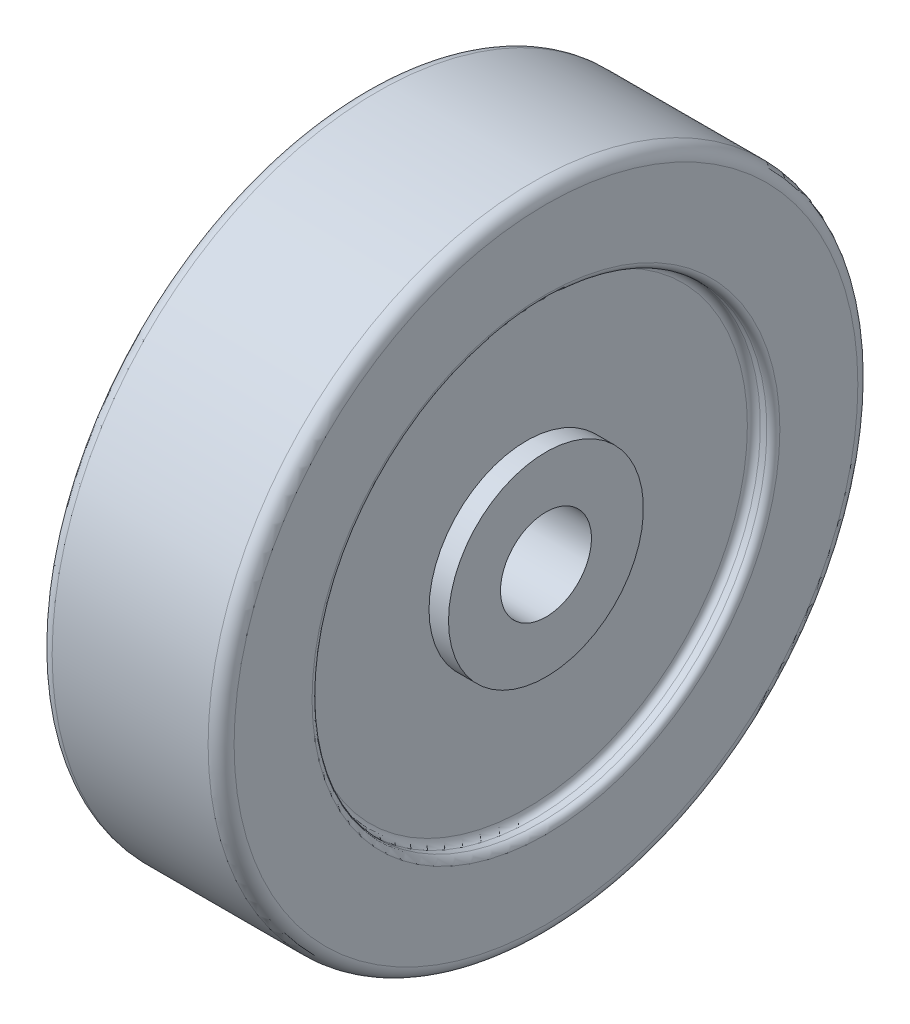
ISO-10303-21;
HEADER;
FILE_DESCRIPTION(('STEP AP214'),'2;1');
FILE_NAME('part.step','',(''),(''),'','','');
FILE_SCHEMA(('AUTOMOTIVE_DESIGN { 1 0 10303 214 1 1 1 1 }'));
ENDSEC;
DATA;
#1=APPLICATION_CONTEXT('core data for automotive mechanical design processes');
#2=APPLICATION_PROTOCOL_DEFINITION('international standard','automotive_design',2000,#1);
#3=PRODUCT_CONTEXT('',#1,'mechanical');
#4=PRODUCT('Part','Part','',(#3));
#5=PRODUCT_RELATED_PRODUCT_CATEGORY('part','',(#4));
#6=PRODUCT_DEFINITION_FORMATION('','',#4);
#7=PRODUCT_DEFINITION_CONTEXT('part definition',#1,'design');
#8=PRODUCT_DEFINITION('design','',#6,#7);
#9=PRODUCT_DEFINITION_SHAPE('','',#8);
#10=(LENGTH_UNIT() NAMED_UNIT(*) SI_UNIT(.MILLI.,.METRE.));
#11=(NAMED_UNIT(*) PLANE_ANGLE_UNIT() SI_UNIT($,.RADIAN.));
#12=(NAMED_UNIT(*) SI_UNIT($,.STERADIAN.) SOLID_ANGLE_UNIT());
#13=UNCERTAINTY_MEASURE_WITH_UNIT(LENGTH_MEASURE(1.E-05),#10,'distance_accuracy_value','');
#14=(GEOMETRIC_REPRESENTATION_CONTEXT(3) GLOBAL_UNCERTAINTY_ASSIGNED_CONTEXT((#13)) GLOBAL_UNIT_ASSIGNED_CONTEXT((#10,
#11,#12)) REPRESENTATION_CONTEXT('',''));
#15=CARTESIAN_POINT('',(0.,0.,0.));
#16=DIRECTION('',(0.,0.,1.));
#17=DIRECTION('',(1.,0.,0.));
#18=AXIS2_PLACEMENT_3D('',#15,#16,#17);
#19=CARTESIAN_POINT('',(0.,15.,0.));
#20=DIRECTION('',(1.,0.,0.));
#21=DIRECTION('',(0.,0.,-1.));
#22=AXIS2_PLACEMENT_3D('',#19,#20,#21);
#23=PLANE('',#22);
#24=CARTESIAN_POINT('',(0.,0.,0.));
#25=DIRECTION('',(-1.,0.,0.));
#26=DIRECTION('',(0.,0.,1.));
#27=AXIS2_PLACEMENT_3D('',#24,#25,#26);
#28=CIRCLE('',#27,7.);
#29=CARTESIAN_POINT('',(0.,0.,7.));
#30=VERTEX_POINT('',#29);
#31=EDGE_CURVE('E86',#30,#30,#28,.T.);
#32=ORIENTED_EDGE('',*,*,#31,.F.);
#33=EDGE_LOOP('',(#32));
#34=FACE_BOUND('',#33,.T.);
#35=CARTESIAN_POINT('',(0.,0.,0.));
#36=DIRECTION('',(-1.,0.,0.));
#37=DIRECTION('',(0.,0.,1.));
#38=AXIS2_PLACEMENT_3D('',#35,#36,#37);
#39=CIRCLE('',#38,15.);
#40=CARTESIAN_POINT('',(0.,0.,15.));
#41=VERTEX_POINT('',#40);
#42=EDGE_CURVE('E101',#41,#41,#39,.T.);
#43=ORIENTED_EDGE('',*,*,#42,.T.);
#44=EDGE_LOOP('',(#43));
#45=FACE_BOUND('',#44,.T.);
#46=ADVANCED_FACE('F42',(#34,#45),#23,.F.);
#47=CARTESIAN_POINT('',(-1.55201062501571,0.,0.));
#48=DIRECTION('',(-1.,0.,0.));
#49=DIRECTION('',(0.,0.,1.));
#50=AXIS2_PLACEMENT_3D('',#47,#48,#49);
#51=CYLINDRICAL_SURFACE('',#50,7.);
#52=CARTESIAN_POINT('',(28.,0.,0.));
#53=DIRECTION('',(-1.,0.,0.));
#54=DIRECTION('',(0.,0.,1.));
#55=AXIS2_PLACEMENT_3D('',#52,#53,#54);
#56=CIRCLE('',#55,7.);
#57=CARTESIAN_POINT('',(28.,0.,7.));
#58=VERTEX_POINT('',#57);
#59=EDGE_CURVE('E89',#58,#58,#56,.T.);
#60=ORIENTED_EDGE('',*,*,#59,.F.);
#61=EDGE_LOOP('',(#60));
#62=FACE_BOUND('',#61,.T.);
#63=ORIENTED_EDGE('',*,*,#31,.T.);
#64=EDGE_LOOP('',(#63));
#65=FACE_BOUND('',#64,.T.);
#66=ADVANCED_FACE('F125',(#62,#65),#51,.F.);
#67=CARTESIAN_POINT('',(28.,7.,0.));
#68=DIRECTION('',(-1.,0.,0.));
#69=DIRECTION('',(0.,0.,1.));
#70=AXIS2_PLACEMENT_3D('',#67,#68,#69);
#71=PLANE('',#70);
#72=CARTESIAN_POINT('',(28.,0.,0.));
#73=DIRECTION('',(-1.,0.,0.));
#74=DIRECTION('',(0.,0.,1.));
#75=AXIS2_PLACEMENT_3D('',#72,#73,#74);
#76=CIRCLE('',#75,15.);
#77=CARTESIAN_POINT('',(28.,0.,15.));
#78=VERTEX_POINT('',#77);
#79=EDGE_CURVE('E92',#78,#78,#76,.T.);
#80=ORIENTED_EDGE('',*,*,#79,.F.);
#81=EDGE_LOOP('',(#80));
#82=FACE_BOUND('',#81,.T.);
#83=ORIENTED_EDGE('',*,*,#59,.T.);
#84=EDGE_LOOP('',(#83));
#85=FACE_BOUND('',#84,.T.);
#86=ADVANCED_FACE('F131',(#82,#85),#71,.F.);
#87=CARTESIAN_POINT('',(-1.55201062501571,0.,0.));
#88=DIRECTION('',(-1.,0.,0.));
#89=DIRECTION('',(0.,0.,1.));
#90=AXIS2_PLACEMENT_3D('',#87,#88,#89);
#91=CYLINDRICAL_SURFACE('',#90,15.);
#92=CARTESIAN_POINT('',(25.,0.,0.));
#93=DIRECTION('',(-1.,0.,0.));
#94=DIRECTION('',(0.,0.,1.));
#95=AXIS2_PLACEMENT_3D('',#92,#93,#94);
#96=CIRCLE('',#95,15.);
#97=CARTESIAN_POINT('',(25.,0.,15.));
#98=VERTEX_POINT('',#97);
#99=EDGE_CURVE('E95',#98,#98,#96,.T.);
#100=ORIENTED_EDGE('',*,*,#99,.F.);
#101=EDGE_LOOP('',(#100));
#102=FACE_BOUND('',#101,.T.);
#103=ORIENTED_EDGE('',*,*,#79,.T.);
#104=EDGE_LOOP('',(#103));
#105=FACE_BOUND('',#104,.T.);
#106=ADVANCED_FACE('F185',(#102,#105),#91,.T.);
#107=CARTESIAN_POINT('',(25.,15.,0.));
#108=DIRECTION('',(-1.,0.,0.));
#109=DIRECTION('',(0.,0.,1.));
#110=AXIS2_PLACEMENT_3D('',#107,#108,#109);
#111=PLANE('',#110);
#112=CARTESIAN_POINT('',(25.,0.,0.));
#113=DIRECTION('',(-1.,0.,0.));
#114=DIRECTION('',(0.,0.,1.));
#115=AXIS2_PLACEMENT_3D('',#112,#113,#114);
#116=CIRCLE('',#115,34.);
#117=CARTESIAN_POINT('',(25.,0.,34.));
#118=VERTEX_POINT('',#117);
#119=EDGE_CURVE('E12',#118,#118,#116,.F.);
#120=ORIENTED_EDGE('',*,*,#119,.T.);
#121=EDGE_LOOP('',(#120));
#122=FACE_BOUND('',#121,.T.);
#123=ORIENTED_EDGE('',*,*,#99,.T.);
#124=EDGE_LOOP('',(#123));
#125=FACE_BOUND('',#124,.T.);
#126=ADVANCED_FACE('F182',(#122,#125),#111,.F.);
#127=CARTESIAN_POINT('',(-1.55201062501571,0.,0.));
#128=DIRECTION('',(-1.,0.,0.));
#129=DIRECTION('',(0.,0.,1.));
#130=AXIS2_PLACEMENT_3D('',#127,#128,#129);
#131=CYLINDRICAL_SURFACE('',#130,35.);
#132=CARTESIAN_POINT('',(27.,0.,0.));
#133=DIRECTION('',(-1.,0.,0.));
#134=DIRECTION('',(0.,0.,1.));
#135=AXIS2_PLACEMENT_3D('',#132,#133,#134);
#136=CIRCLE('',#135,35.);
#137=CARTESIAN_POINT('',(27.,0.,35.));
#138=VERTEX_POINT('',#137);
#139=EDGE_CURVE('E49',#138,#138,#136,.F.);
#140=ORIENTED_EDGE('',*,*,#139,.T.);
#141=EDGE_LOOP('',(#140));
#142=FACE_BOUND('',#141,.T.);
#143=CARTESIAN_POINT('',(26.,0.,0.));
#144=DIRECTION('',(-1.,0.,0.));
#145=DIRECTION('',(0.,0.,1.));
#146=AXIS2_PLACEMENT_3D('',#143,#144,#145);
#147=CIRCLE('',#146,35.);
#148=CARTESIAN_POINT('',(26.,0.,35.));
#149=VERTEX_POINT('',#148);
#150=EDGE_CURVE('E53',#149,#149,#147,.T.);
#151=ORIENTED_EDGE('',*,*,#150,.T.);
#152=EDGE_LOOP('',(#151));
#153=FACE_BOUND('',#152,.T.);
#154=ADVANCED_FACE('F165',(#142,#153),#131,.F.);
#155=CARTESIAN_POINT('',(28.,35.,0.));
#156=DIRECTION('',(-1.,0.,0.));
#157=DIRECTION('',(0.,0.,1.));
#158=AXIS2_PLACEMENT_3D('',#155,#156,#157);
#159=PLANE('',#158);
#160=CARTESIAN_POINT('',(28.,0.,0.));
#161=DIRECTION('',(-1.,0.,0.));
#162=DIRECTION('',(0.,0.,1.));
#163=AXIS2_PLACEMENT_3D('',#160,#161,#162);
#164=CIRCLE('',#163,36.);
#165=CARTESIAN_POINT('',(28.,0.,36.));
#166=VERTEX_POINT('',#165);
#167=EDGE_CURVE('E57',#166,#166,#164,.T.);
#168=ORIENTED_EDGE('',*,*,#167,.T.);
#169=EDGE_LOOP('',(#168));
#170=FACE_BOUND('',#169,.T.);
#171=CARTESIAN_POINT('',(28.,0.,0.));
#172=DIRECTION('',(-1.,0.,0.));
#173=DIRECTION('',(0.,0.,1.));
#174=AXIS2_PLACEMENT_3D('',#171,#172,#173);
#175=CIRCLE('',#174,48.);
#176=CARTESIAN_POINT('',(28.,0.,48.));
#177=VERTEX_POINT('',#176);
#178=EDGE_CURVE('E74',#177,#177,#175,.F.);
#179=ORIENTED_EDGE('',*,*,#178,.T.);
#180=EDGE_LOOP('',(#179));
#181=FACE_BOUND('',#180,.T.);
#182=ADVANCED_FACE('F161',(#170,#181),#159,.F.);
#183=CARTESIAN_POINT('',(-1.55201062501571,0.,0.));
#184=DIRECTION('',(-1.,0.,0.));
#185=DIRECTION('',(0.,0.,1.));
#186=AXIS2_PLACEMENT_3D('',#183,#184,#185);
#187=CYLINDRICAL_SURFACE('',#186,50.);
#188=CARTESIAN_POINT('',(2.,0.,0.));
#189=DIRECTION('',(1.,0.,0.));
#190=DIRECTION('',(0.,0.,-1.));
#191=AXIS2_PLACEMENT_3D('',#188,#189,#190);
#192=CIRCLE('',#191,50.);
#193=CARTESIAN_POINT('',(2.,0.,-50.));
#194=VERTEX_POINT('',#193);
#195=EDGE_CURVE('E77',#194,#194,#192,.T.);
#196=ORIENTED_EDGE('',*,*,#195,.T.);
#197=EDGE_LOOP('',(#196));
#198=FACE_BOUND('',#197,.T.);
#199=CARTESIAN_POINT('',(26.,0.,0.));
#200=DIRECTION('',(-1.,0.,0.));
#201=DIRECTION('',(0.,0.,1.));
#202=AXIS2_PLACEMENT_3D('',#199,#200,#201);
#203=CIRCLE('',#202,50.);
#204=CARTESIAN_POINT('',(26.,0.,50.));
#205=VERTEX_POINT('',#204);
#206=EDGE_CURVE('E80',#205,#205,#203,.T.);
#207=ORIENTED_EDGE('',*,*,#206,.T.);
#208=EDGE_LOOP('',(#207));
#209=FACE_BOUND('',#208,.T.);
#210=ADVANCED_FACE('F164',(#198,#209),#187,.T.);
#211=CARTESIAN_POINT('',(0.,50.,0.));
#212=DIRECTION('',(1.,0.,0.));
#213=DIRECTION('',(0.,0.,-1.));
#214=AXIS2_PLACEMENT_3D('',#211,#212,#213);
#215=PLANE('',#214);
#216=CARTESIAN_POINT('',(0.,0.,0.));
#217=DIRECTION('',(1.,0.,0.));
#218=DIRECTION('',(0.,0.,-1.));
#219=AXIS2_PLACEMENT_3D('',#216,#217,#218);
#220=CIRCLE('',#219,36.);
#221=CARTESIAN_POINT('',(0.,0.,-36.));
#222=VERTEX_POINT('',#221);
#223=EDGE_CURVE('E65',#222,#222,#220,.T.);
#224=ORIENTED_EDGE('',*,*,#223,.T.);
#225=EDGE_LOOP('',(#224));
#226=FACE_BOUND('',#225,.T.);
#227=CARTESIAN_POINT('',(0.,0.,0.));
#228=DIRECTION('',(1.,0.,0.));
#229=DIRECTION('',(0.,0.,-1.));
#230=AXIS2_PLACEMENT_3D('',#227,#228,#229);
#231=CIRCLE('',#230,48.);
#232=CARTESIAN_POINT('',(0.,0.,-48.));
#233=VERTEX_POINT('',#232);
#234=EDGE_CURVE('E83',#233,#233,#231,.F.);
#235=ORIENTED_EDGE('',*,*,#234,.T.);
#236=EDGE_LOOP('',(#235));
#237=FACE_BOUND('',#236,.T.);
#238=ADVANCED_FACE('F121',(#226,#237),#215,.F.);
#239=CARTESIAN_POINT('',(-1.55201062501571,0.,0.));
#240=DIRECTION('',(-1.,0.,0.));
#241=DIRECTION('',(0.,0.,1.));
#242=AXIS2_PLACEMENT_3D('',#239,#240,#241);
#243=CYLINDRICAL_SURFACE('',#242,35.);
#244=CARTESIAN_POINT('',(0.999999999999998,0.,0.));
#245=DIRECTION('',(1.,0.,0.));
#246=DIRECTION('',(0.,0.,-1.));
#247=AXIS2_PLACEMENT_3D('',#244,#245,#246);
#248=CIRCLE('',#247,35.);
#249=CARTESIAN_POINT('',(0.999999999999998,0.,-35.));
#250=VERTEX_POINT('',#249);
#251=EDGE_CURVE('E68',#250,#250,#248,.F.);
#252=ORIENTED_EDGE('',*,*,#251,.T.);
#253=EDGE_LOOP('',(#252));
#254=FACE_BOUND('',#253,.T.);
#255=CARTESIAN_POINT('',(2.,0.,0.));
#256=DIRECTION('',(1.,0.,0.));
#257=DIRECTION('',(0.,0.,-1.));
#258=AXIS2_PLACEMENT_3D('',#255,#256,#257);
#259=CIRCLE('',#258,35.);
#260=CARTESIAN_POINT('',(2.,0.,-35.));
#261=VERTEX_POINT('',#260);
#262=EDGE_CURVE('E71',#261,#261,#259,.T.);
#263=ORIENTED_EDGE('',*,*,#262,.T.);
#264=EDGE_LOOP('',(#263));
#265=FACE_BOUND('',#264,.T.);
#266=ADVANCED_FACE('F115',(#254,#265),#243,.F.);
#267=CARTESIAN_POINT('',(3.,35.,0.));
#268=DIRECTION('',(1.,0.,0.));
#269=DIRECTION('',(0.,0.,-1.));
#270=AXIS2_PLACEMENT_3D('',#267,#268,#269);
#271=PLANE('',#270);
#272=CARTESIAN_POINT('',(3.,0.,0.));
#273=DIRECTION('',(1.,0.,0.));
#274=DIRECTION('',(0.,0.,-1.));
#275=AXIS2_PLACEMENT_3D('',#272,#273,#274);
#276=CIRCLE('',#275,34.);
#277=CARTESIAN_POINT('',(3.,0.,-34.));
#278=VERTEX_POINT('',#277);
#279=EDGE_CURVE('E62',#278,#278,#276,.F.);
#280=ORIENTED_EDGE('',*,*,#279,.T.);
#281=EDGE_LOOP('',(#280));
#282=FACE_BOUND('',#281,.T.);
#283=CARTESIAN_POINT('',(3.,0.,0.));
#284=DIRECTION('',(-1.,0.,0.));
#285=DIRECTION('',(0.,0.,1.));
#286=AXIS2_PLACEMENT_3D('',#283,#284,#285);
#287=CIRCLE('',#286,15.);
#288=CARTESIAN_POINT('',(3.,0.,15.));
#289=VERTEX_POINT('',#288);
#290=EDGE_CURVE('E98',#289,#289,#287,.T.);
#291=ORIENTED_EDGE('',*,*,#290,.F.);
#292=EDGE_LOOP('',(#291));
#293=FACE_BOUND('',#292,.T.);
#294=ADVANCED_FACE('F110',(#282,#293),#271,.F.);
#295=CARTESIAN_POINT('',(-1.55201062501571,0.,0.));
#296=DIRECTION('',(-1.,0.,0.));
#297=DIRECTION('',(0.,0.,1.));
#298=AXIS2_PLACEMENT_3D('',#295,#296,#297);
#299=CYLINDRICAL_SURFACE('',#298,15.);
#300=ORIENTED_EDGE('',*,*,#42,.F.);
#301=EDGE_LOOP('',(#300));
#302=FACE_BOUND('',#301,.T.);
#303=ORIENTED_EDGE('',*,*,#290,.T.);
#304=EDGE_LOOP('',(#303));
#305=FACE_BOUND('',#304,.T.);
#306=ADVANCED_FACE('F106',(#302,#305),#299,.T.);
#307=CARTESIAN_POINT('',(2.,0.,0.));
#308=DIRECTION('',(1.,0.,0.));
#309=DIRECTION('',(0.,0.,-1.));
#310=AXIS2_PLACEMENT_3D('',#307,#308,#309);
#311=TOROIDAL_SURFACE('',#310,48.,2.);
#312=ORIENTED_EDGE('',*,*,#195,.F.);
#313=EDGE_LOOP('',(#312));
#314=FACE_BOUND('',#313,.T.);
#315=ORIENTED_EDGE('',*,*,#234,.F.);
#316=EDGE_LOOP('',(#315));
#317=FACE_BOUND('',#316,.T.);
#318=ADVANCED_FACE('F109',(#314,#317),#311,.T.);
#319=CARTESIAN_POINT('',(26.,0.,0.));
#320=DIRECTION('',(-1.,0.,0.));
#321=DIRECTION('',(0.,0.,1.));
#322=AXIS2_PLACEMENT_3D('',#319,#320,#321);
#323=TOROIDAL_SURFACE('',#322,48.,2.);
#324=ORIENTED_EDGE('',*,*,#178,.F.);
#325=EDGE_LOOP('',(#324));
#326=FACE_BOUND('',#325,.T.);
#327=ORIENTED_EDGE('',*,*,#206,.F.);
#328=EDGE_LOOP('',(#327));
#329=FACE_BOUND('',#328,.T.);
#330=ADVANCED_FACE('F139',(#326,#329),#323,.T.);
#331=CARTESIAN_POINT('',(0.999999999999998,0.,0.));
#332=DIRECTION('',(1.,0.,0.));
#333=DIRECTION('',(0.,0.,-1.));
#334=AXIS2_PLACEMENT_3D('',#331,#332,#333);
#335=TOROIDAL_SURFACE('',#334,36.,1.);
#336=ORIENTED_EDGE('',*,*,#223,.F.);
#337=EDGE_LOOP('',(#336));
#338=FACE_BOUND('',#337,.T.);
#339=ORIENTED_EDGE('',*,*,#251,.F.);
#340=EDGE_LOOP('',(#339));
#341=FACE_BOUND('',#340,.T.);
#342=ADVANCED_FACE('F143',(#338,#341),#335,.T.);
#343=CARTESIAN_POINT('',(2.,0.,0.));
#344=DIRECTION('',(1.,0.,0.));
#345=DIRECTION('',(0.,0.,-1.));
#346=AXIS2_PLACEMENT_3D('',#343,#344,#345);
#347=TOROIDAL_SURFACE('',#346,34.,1.);
#348=ORIENTED_EDGE('',*,*,#262,.F.);
#349=EDGE_LOOP('',(#348));
#350=FACE_BOUND('',#349,.T.);
#351=ORIENTED_EDGE('',*,*,#279,.F.);
#352=EDGE_LOOP('',(#351));
#353=FACE_BOUND('',#352,.T.);
#354=ADVANCED_FACE('F147',(#350,#353),#347,.F.);
#355=CARTESIAN_POINT('',(27.,0.,0.));
#356=DIRECTION('',(-1.,0.,0.));
#357=DIRECTION('',(0.,0.,1.));
#358=AXIS2_PLACEMENT_3D('',#355,#356,#357);
#359=TOROIDAL_SURFACE('',#358,36.,1.);
#360=ORIENTED_EDGE('',*,*,#139,.F.);
#361=EDGE_LOOP('',(#360));
#362=FACE_BOUND('',#361,.T.);
#363=ORIENTED_EDGE('',*,*,#167,.F.);
#364=EDGE_LOOP('',(#363));
#365=FACE_BOUND('',#364,.T.);
#366=ADVANCED_FACE('F150',(#362,#365),#359,.T.);
#367=CARTESIAN_POINT('',(26.,0.,0.));
#368=DIRECTION('',(-1.,0.,0.));
#369=DIRECTION('',(0.,0.,1.));
#370=AXIS2_PLACEMENT_3D('',#367,#368,#369);
#371=TOROIDAL_SURFACE('',#370,34.,1.);
#372=ORIENTED_EDGE('',*,*,#119,.F.);
#373=EDGE_LOOP('',(#372));
#374=FACE_BOUND('',#373,.T.);
#375=ORIENTED_EDGE('',*,*,#150,.F.);
#376=EDGE_LOOP('',(#375));
#377=FACE_BOUND('',#376,.T.);
#378=ADVANCED_FACE('F44',(#374,#377),#371,.F.);
#379=CLOSED_SHELL('',(#46,#66,#86,#106,#126,#154,#182,#210,#238,#266,#294,#306,#318,#330,#342,
#354,#366,#378));
#380=MANIFOLD_SOLID_BREP('B2',#379);
#381=ADVANCED_BREP_SHAPE_REPRESENTATION('',(#18,#380),#14);
#382=SHAPE_DEFINITION_REPRESENTATION(#9,#381);
ENDSEC;
END-ISO-10303-21;
